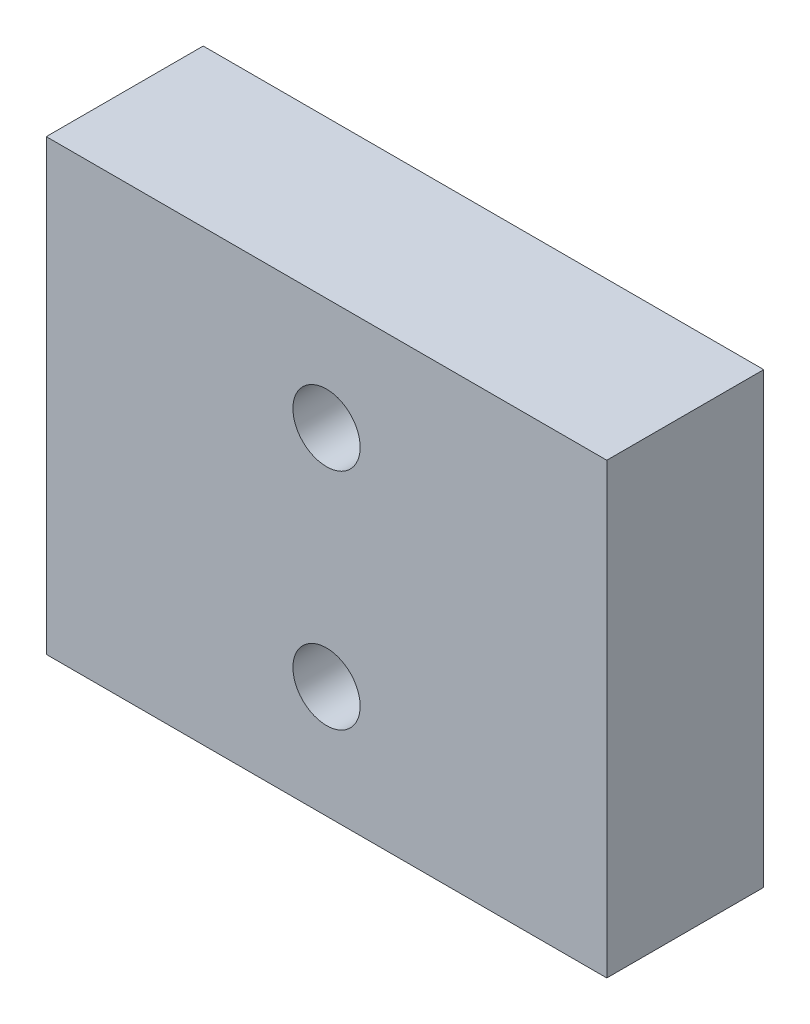
ISO-10303-21;
HEADER;
FILE_DESCRIPTION(('STEP AP214'),'2;1');
FILE_NAME('part.step','',(''),(''),'','','');
FILE_SCHEMA(('AUTOMOTIVE_DESIGN { 1 0 10303 214 1 1 1 1 }'));
ENDSEC;
DATA;
#1=APPLICATION_CONTEXT('core data for automotive mechanical design processes');
#2=APPLICATION_PROTOCOL_DEFINITION('international standard','automotive_design',2000,#1);
#3=PRODUCT_CONTEXT('',#1,'mechanical');
#4=PRODUCT('Part','Part','',(#3));
#5=PRODUCT_RELATED_PRODUCT_CATEGORY('part','',(#4));
#6=PRODUCT_DEFINITION_FORMATION('','',#4);
#7=PRODUCT_DEFINITION_CONTEXT('part definition',#1,'design');
#8=PRODUCT_DEFINITION('design','',#6,#7);
#9=PRODUCT_DEFINITION_SHAPE('','',#8);
#10=(LENGTH_UNIT() NAMED_UNIT(*) SI_UNIT(.MILLI.,.METRE.));
#11=(NAMED_UNIT(*) PLANE_ANGLE_UNIT() SI_UNIT($,.RADIAN.));
#12=(NAMED_UNIT(*) SI_UNIT($,.STERADIAN.) SOLID_ANGLE_UNIT());
#13=UNCERTAINTY_MEASURE_WITH_UNIT(LENGTH_MEASURE(1.E-05),#10,'distance_accuracy_value','');
#14=(GEOMETRIC_REPRESENTATION_CONTEXT(3) GLOBAL_UNCERTAINTY_ASSIGNED_CONTEXT((#13)) GLOBAL_UNIT_ASSIGNED_CONTEXT((#10,
#11,#12)) REPRESENTATION_CONTEXT('',''));
#15=CARTESIAN_POINT('',(0.,0.,0.));
#16=DIRECTION('',(0.,0.,1.));
#17=DIRECTION('',(1.,0.,0.));
#18=AXIS2_PLACEMENT_3D('',#15,#16,#17);
#19=CARTESIAN_POINT('',(0.,0.,7.));
#20=DIRECTION('',(1.,0.,0.));
#21=DIRECTION('',(0.,0.,-1.));
#22=AXIS2_PLACEMENT_3D('',#19,#20,#21);
#23=PLANE('',#22);
#24=DIRECTION('',(0.,-1.,0.));
#25=VECTOR('',#24,1.);
#26=CARTESIAN_POINT('',(0.,0.,0.));
#27=LINE('',#26,#25);
#28=CARTESIAN_POINT('',(0.,20.,0.));
#29=VERTEX_POINT('',#28);
#30=CARTESIAN_POINT('',(0.,0.,0.));
#31=VERTEX_POINT('',#30);
#32=EDGE_CURVE('E100',#29,#31,#27,.T.);
#33=ORIENTED_EDGE('',*,*,#32,.T.);
#34=DIRECTION('',(0.,0.,-1.));
#35=VECTOR('',#34,1.);
#36=CARTESIAN_POINT('',(0.,0.,7.));
#37=LINE('',#36,#35);
#38=CARTESIAN_POINT('',(0.,0.,7.));
#39=VERTEX_POINT('',#38);
#40=EDGE_CURVE('E11',#39,#31,#37,.T.);
#41=ORIENTED_EDGE('',*,*,#40,.F.);
#42=DIRECTION('',(0.,-1.,0.));
#43=VECTOR('',#42,1.);
#44=CARTESIAN_POINT('',(0.,0.,7.));
#45=LINE('',#44,#43);
#46=CARTESIAN_POINT('',(0.,20.,7.));
#47=VERTEX_POINT('',#46);
#48=EDGE_CURVE('E88',#47,#39,#45,.T.);
#49=ORIENTED_EDGE('',*,*,#48,.F.);
#50=DIRECTION('',(0.,0.,-1.));
#51=VECTOR('',#50,1.);
#52=CARTESIAN_POINT('',(0.,20.,7.));
#53=LINE('',#52,#51);
#54=EDGE_CURVE('E96',#47,#29,#53,.T.);
#55=ORIENTED_EDGE('',*,*,#54,.T.);
#56=EDGE_LOOP('',(#33,#41,#49,#55));
#57=FACE_BOUND('',#56,.T.);
#58=ADVANCED_FACE('F37',(#57),#23,.F.);
#59=CARTESIAN_POINT('',(0.,0.,7.));
#60=DIRECTION('',(0.,1.,0.));
#61=DIRECTION('',(0.,0.,1.));
#62=AXIS2_PLACEMENT_3D('',#59,#60,#61);
#63=PLANE('',#62);
#64=DIRECTION('',(1.,0.,0.));
#65=VECTOR('',#64,1.);
#66=CARTESIAN_POINT('',(0.,0.,0.));
#67=LINE('',#66,#65);
#68=CARTESIAN_POINT('',(25.,0.,0.));
#69=VERTEX_POINT('',#68);
#70=EDGE_CURVE('E92',#31,#69,#67,.T.);
#71=ORIENTED_EDGE('',*,*,#70,.T.);
#72=DIRECTION('',(0.,0.,-1.));
#73=VECTOR('',#72,1.);
#74=CARTESIAN_POINT('',(25.,0.,7.));
#75=LINE('',#74,#73);
#76=CARTESIAN_POINT('',(25.,0.,7.));
#77=VERTEX_POINT('',#76);
#78=EDGE_CURVE('E45',#77,#69,#75,.T.);
#79=ORIENTED_EDGE('',*,*,#78,.F.);
#80=DIRECTION('',(1.,0.,0.));
#81=VECTOR('',#80,1.);
#82=CARTESIAN_POINT('',(0.,0.,7.));
#83=LINE('',#82,#81);
#84=EDGE_CURVE('E83',#39,#77,#83,.T.);
#85=ORIENTED_EDGE('',*,*,#84,.F.);
#86=ORIENTED_EDGE('',*,*,#40,.T.);
#87=EDGE_LOOP('',(#71,#79,#85,#86));
#88=FACE_BOUND('',#87,.T.);
#89=ADVANCED_FACE('F91',(#88),#63,.F.);
#90=CARTESIAN_POINT('',(25.,0.,7.));
#91=DIRECTION('',(-1.,0.,0.));
#92=DIRECTION('',(0.,0.,1.));
#93=AXIS2_PLACEMENT_3D('',#90,#91,#92);
#94=PLANE('',#93);
#95=DIRECTION('',(0.,1.,0.));
#96=VECTOR('',#95,1.);
#97=CARTESIAN_POINT('',(25.,0.,0.));
#98=LINE('',#97,#96);
#99=CARTESIAN_POINT('',(25.,20.,0.));
#100=VERTEX_POINT('',#99);
#101=EDGE_CURVE('E70',#69,#100,#98,.T.);
#102=ORIENTED_EDGE('',*,*,#101,.T.);
#103=DIRECTION('',(0.,0.,-1.));
#104=VECTOR('',#103,1.);
#105=CARTESIAN_POINT('',(25.,20.,7.));
#106=LINE('',#105,#104);
#107=CARTESIAN_POINT('',(25.,20.,7.));
#108=VERTEX_POINT('',#107);
#109=EDGE_CURVE('E93',#108,#100,#106,.T.);
#110=ORIENTED_EDGE('',*,*,#109,.F.);
#111=DIRECTION('',(0.,1.,0.));
#112=VECTOR('',#111,1.);
#113=CARTESIAN_POINT('',(25.,0.,7.));
#114=LINE('',#113,#112);
#115=EDGE_CURVE('E86',#77,#108,#114,.T.);
#116=ORIENTED_EDGE('',*,*,#115,.F.);
#117=ORIENTED_EDGE('',*,*,#78,.T.);
#118=EDGE_LOOP('',(#102,#110,#116,#117));
#119=FACE_BOUND('',#118,.T.);
#120=ADVANCED_FACE('F94',(#119),#94,.F.);
#121=CARTESIAN_POINT('',(0.,20.,7.));
#122=DIRECTION('',(0.,-1.,0.));
#123=DIRECTION('',(0.,0.,-1.));
#124=AXIS2_PLACEMENT_3D('',#121,#122,#123);
#125=PLANE('',#124);
#126=DIRECTION('',(-1.,0.,0.));
#127=VECTOR('',#126,1.);
#128=CARTESIAN_POINT('',(0.,20.,0.));
#129=LINE('',#128,#127);
#130=EDGE_CURVE('E76',#100,#29,#129,.T.);
#131=ORIENTED_EDGE('',*,*,#130,.T.);
#132=ORIENTED_EDGE('',*,*,#54,.F.);
#133=DIRECTION('',(-1.,0.,0.));
#134=VECTOR('',#133,1.);
#135=CARTESIAN_POINT('',(0.,20.,7.));
#136=LINE('',#135,#134);
#137=EDGE_CURVE('E53',#108,#47,#136,.T.);
#138=ORIENTED_EDGE('',*,*,#137,.F.);
#139=ORIENTED_EDGE('',*,*,#109,.T.);
#140=EDGE_LOOP('',(#131,#132,#138,#139));
#141=FACE_BOUND('',#140,.T.);
#142=ADVANCED_FACE('F108',(#141),#125,.F.);
#143=CARTESIAN_POINT('',(0.,0.,7.));
#144=DIRECTION('',(0.,0.,-1.));
#145=DIRECTION('',(-1.,0.,0.));
#146=AXIS2_PLACEMENT_3D('',#143,#144,#145);
#147=PLANE('',#146);
#148=CARTESIAN_POINT('',(12.5,15.,7.));
#149=DIRECTION('',(0.,0.,1.));
#150=DIRECTION('',(1.,0.,0.));
#151=AXIS2_PLACEMENT_3D('',#148,#149,#150);
#152=CIRCLE('',#151,1.5);
#153=CARTESIAN_POINT('',(14.,15.,7.));
#154=VERTEX_POINT('',#153);
#155=EDGE_CURVE('E120',#154,#154,#152,.T.);
#156=ORIENTED_EDGE('',*,*,#155,.F.);
#157=EDGE_LOOP('',(#156));
#158=FACE_BOUND('',#157,.T.);
#159=CARTESIAN_POINT('',(12.5,5.,7.));
#160=DIRECTION('',(0.,0.,1.));
#161=DIRECTION('',(1.,0.,0.));
#162=AXIS2_PLACEMENT_3D('',#159,#160,#161);
#163=CIRCLE('',#162,1.5);
#164=CARTESIAN_POINT('',(14.,5.,7.));
#165=VERTEX_POINT('',#164);
#166=EDGE_CURVE('E114',#165,#165,#163,.T.);
#167=ORIENTED_EDGE('',*,*,#166,.F.);
#168=EDGE_LOOP('',(#167));
#169=FACE_BOUND('',#168,.T.);
#170=ORIENTED_EDGE('',*,*,#48,.T.);
#171=ORIENTED_EDGE('',*,*,#84,.T.);
#172=ORIENTED_EDGE('',*,*,#115,.T.);
#173=ORIENTED_EDGE('',*,*,#137,.T.);
#174=EDGE_LOOP('',(#170,#171,#172,#173));
#175=FACE_BOUND('',#174,.T.);
#176=ADVANCED_FACE('F84',(#158,#169,#175),#147,.F.);
#177=CARTESIAN_POINT('',(0.,0.,0.));
#178=DIRECTION('',(0.,0.,-1.));
#179=DIRECTION('',(-1.,0.,0.));
#180=AXIS2_PLACEMENT_3D('',#177,#178,#179);
#181=PLANE('',#180);
#182=ORIENTED_EDGE('',*,*,#32,.F.);
#183=ORIENTED_EDGE('',*,*,#130,.F.);
#184=ORIENTED_EDGE('',*,*,#101,.F.);
#185=ORIENTED_EDGE('',*,*,#70,.F.);
#186=EDGE_LOOP('',(#182,#183,#184,#185));
#187=FACE_BOUND('',#186,.T.);
#188=ADVANCED_FACE('F111',(#187),#181,.T.);
#189=CARTESIAN_POINT('',(12.5,5.,4.));
#190=DIRECTION('',(0.,0.,1.));
#191=DIRECTION('',(1.,0.,0.));
#192=AXIS2_PLACEMENT_3D('',#189,#190,#191);
#193=CYLINDRICAL_SURFACE('',#192,1.5);
#194=CARTESIAN_POINT('',(12.5,5.,4.));
#195=DIRECTION('',(0.,0.,1.));
#196=DIRECTION('',(1.,0.,0.));
#197=AXIS2_PLACEMENT_3D('',#194,#195,#196);
#198=CIRCLE('',#197,1.5);
#199=CARTESIAN_POINT('',(14.,5.,4.));
#200=VERTEX_POINT('',#199);
#201=EDGE_CURVE('E117',#200,#200,#198,.T.);
#202=ORIENTED_EDGE('',*,*,#201,.F.);
#203=EDGE_LOOP('',(#202));
#204=FACE_BOUND('',#203,.T.);
#205=ORIENTED_EDGE('',*,*,#166,.T.);
#206=EDGE_LOOP('',(#205));
#207=FACE_BOUND('',#206,.T.);
#208=ADVANCED_FACE('F140',(#204,#207),#193,.F.);
#209=CARTESIAN_POINT('',(12.5,5.,4.));
#210=DIRECTION('',(0.,0.,1.));
#211=DIRECTION('',(1.,0.,0.));
#212=AXIS2_PLACEMENT_3D('',#209,#210,#211);
#213=PLANE('',#212);
#214=ORIENTED_EDGE('',*,*,#201,.T.);
#215=EDGE_LOOP('',(#214));
#216=FACE_BOUND('',#215,.T.);
#217=ADVANCED_FACE('F131',(#216),#213,.T.);
#218=CARTESIAN_POINT('',(12.5,15.,4.));
#219=DIRECTION('',(0.,0.,1.));
#220=DIRECTION('',(1.,0.,0.));
#221=AXIS2_PLACEMENT_3D('',#218,#219,#220);
#222=CYLINDRICAL_SURFACE('',#221,1.5);
#223=CARTESIAN_POINT('',(12.5,15.,4.));
#224=DIRECTION('',(0.,0.,1.));
#225=DIRECTION('',(1.,0.,0.));
#226=AXIS2_PLACEMENT_3D('',#223,#224,#225);
#227=CIRCLE('',#226,1.5);
#228=CARTESIAN_POINT('',(14.,15.,4.));
#229=VERTEX_POINT('',#228);
#230=EDGE_CURVE('E103',#229,#229,#227,.T.);
#231=ORIENTED_EDGE('',*,*,#230,.F.);
#232=EDGE_LOOP('',(#231));
#233=FACE_BOUND('',#232,.T.);
#234=ORIENTED_EDGE('',*,*,#155,.T.);
#235=EDGE_LOOP('',(#234));
#236=FACE_BOUND('',#235,.T.);
#237=ADVANCED_FACE('F128',(#233,#236),#222,.F.);
#238=CARTESIAN_POINT('',(12.5,15.,4.));
#239=DIRECTION('',(0.,0.,1.));
#240=DIRECTION('',(1.,0.,0.));
#241=AXIS2_PLACEMENT_3D('',#238,#239,#240);
#242=PLANE('',#241);
#243=ORIENTED_EDGE('',*,*,#230,.T.);
#244=EDGE_LOOP('',(#243));
#245=FACE_BOUND('',#244,.T.);
#246=ADVANCED_FACE('F126',(#245),#242,.T.);
#247=CLOSED_SHELL('',(#58,#89,#120,#142,#176,#188,#208,#217,#237,#246));
#248=MANIFOLD_SOLID_BREP('B2',#247);
#249=ADVANCED_BREP_SHAPE_REPRESENTATION('',(#18,#248),#14);
#250=SHAPE_DEFINITION_REPRESENTATION(#9,#249);
ENDSEC;
END-ISO-10303-21;
